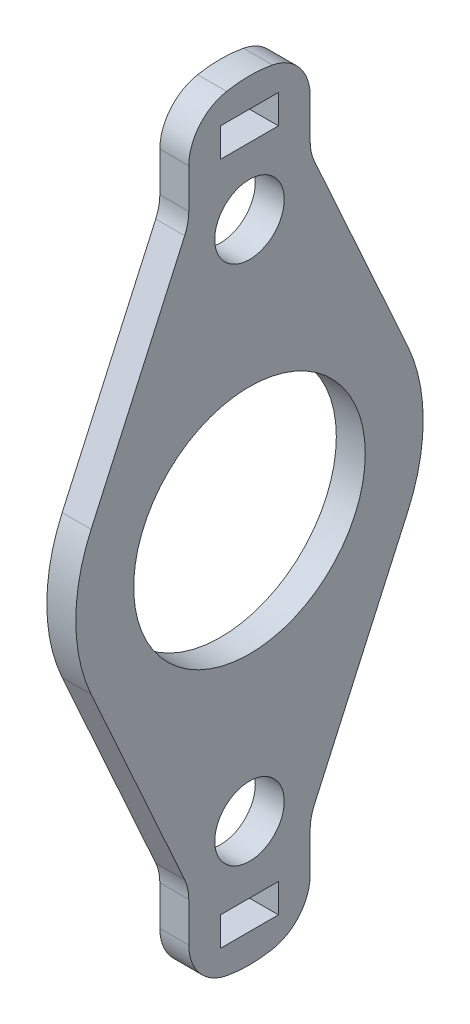
ISO-10303-21;
HEADER;
FILE_DESCRIPTION(('STEP AP214'),'2;1');
FILE_NAME('part.step','',(''),(''),'','','');
FILE_SCHEMA(('AUTOMOTIVE_DESIGN { 1 0 10303 214 1 1 1 1 }'));
ENDSEC;
DATA;
#1=APPLICATION_CONTEXT('core data for automotive mechanical design processes');
#2=APPLICATION_PROTOCOL_DEFINITION('international standard','automotive_design',2000,#1);
#3=PRODUCT_CONTEXT('',#1,'mechanical');
#4=PRODUCT('Part','Part','',(#3));
#5=PRODUCT_RELATED_PRODUCT_CATEGORY('part','',(#4));
#6=PRODUCT_DEFINITION_FORMATION('','',#4);
#7=PRODUCT_DEFINITION_CONTEXT('part definition',#1,'design');
#8=PRODUCT_DEFINITION('design','',#6,#7);
#9=PRODUCT_DEFINITION_SHAPE('','',#8);
#10=(LENGTH_UNIT() NAMED_UNIT(*) SI_UNIT(.MILLI.,.METRE.));
#11=(NAMED_UNIT(*) PLANE_ANGLE_UNIT() SI_UNIT($,.RADIAN.));
#12=(NAMED_UNIT(*) SI_UNIT($,.STERADIAN.) SOLID_ANGLE_UNIT());
#13=UNCERTAINTY_MEASURE_WITH_UNIT(LENGTH_MEASURE(1.E-05),#10,'distance_accuracy_value','');
#14=(GEOMETRIC_REPRESENTATION_CONTEXT(3) GLOBAL_UNCERTAINTY_ASSIGNED_CONTEXT((#13)) GLOBAL_UNIT_ASSIGNED_CONTEXT((#10,
#11,#12)) REPRESENTATION_CONTEXT('',''));
#15=CARTESIAN_POINT('',(0.,0.,0.));
#16=DIRECTION('',(0.,0.,1.));
#17=DIRECTION('',(1.,0.,0.));
#18=AXIS2_PLACEMENT_3D('',#15,#16,#17);
#19=CARTESIAN_POINT('',(2.5,0.,0.));
#20=DIRECTION('',(1.,0.,0.));
#21=DIRECTION('',(0.,0.,-1.));
#22=AXIS2_PLACEMENT_3D('',#19,#20,#21);
#23=PLANE('',#22);
#24=DIRECTION('',(0.,0.,1.));
#25=VECTOR('',#24,1.);
#26=CARTESIAN_POINT('',(2.5,61.5,-5.00000000000002));
#27=LINE('',#26,#25);
#28=CARTESIAN_POINT('',(2.5,61.5,-5.00000000000002));
#29=VERTEX_POINT('',#28);
#30=CARTESIAN_POINT('',(2.5,61.5,4.99999999999998));
#31=VERTEX_POINT('',#30);
#32=EDGE_CURVE('E234',#29,#31,#27,.T.);
#33=ORIENTED_EDGE('',*,*,#32,.F.);
#34=DIRECTION('',(0.,1.,0.));
#35=VECTOR('',#34,1.);
#36=CARTESIAN_POINT('',(2.5,61.5,-5.00000000000002));
#37=LINE('',#36,#35);
#38=CARTESIAN_POINT('',(2.5,56.5,-5.00000000000002));
#39=VERTEX_POINT('',#38);
#40=EDGE_CURVE('E226',#39,#29,#37,.T.);
#41=ORIENTED_EDGE('',*,*,#40,.F.);
#42=DIRECTION('',(0.,0.,-1.));
#43=VECTOR('',#42,1.);
#44=CARTESIAN_POINT('',(2.5,56.5,-5.00000000000002));
#45=LINE('',#44,#43);
#46=CARTESIAN_POINT('',(2.5,56.5,4.99999999999998));
#47=VERTEX_POINT('',#46);
#48=EDGE_CURVE('E249',#47,#39,#45,.T.);
#49=ORIENTED_EDGE('',*,*,#48,.F.);
#50=DIRECTION('',(0.,-1.,0.));
#51=VECTOR('',#50,1.);
#52=CARTESIAN_POINT('',(2.5,61.5,4.99999999999998));
#53=LINE('',#52,#51);
#54=EDGE_CURVE('E247',#31,#47,#53,.T.);
#55=ORIENTED_EDGE('',*,*,#54,.F.);
#56=EDGE_LOOP('',(#33,#41,#49,#55));
#57=FACE_BOUND('',#56,.T.);
#58=DIRECTION('',(0.,0.,1.));
#59=VECTOR('',#58,1.);
#60=CARTESIAN_POINT('',(2.5,-56.5,-5.00000000000002));
#61=LINE('',#60,#59);
#62=CARTESIAN_POINT('',(2.5,-56.5,-5.00000000000002));
#63=VERTEX_POINT('',#62);
#64=CARTESIAN_POINT('',(2.5,-56.5,4.99999999999998));
#65=VERTEX_POINT('',#64);
#66=EDGE_CURVE('E267',#63,#65,#61,.T.);
#67=ORIENTED_EDGE('',*,*,#66,.F.);
#68=DIRECTION('',(0.,1.,0.));
#69=VECTOR('',#68,1.);
#70=CARTESIAN_POINT('',(2.5,-61.5,-5.00000000000002));
#71=LINE('',#70,#69);
#72=CARTESIAN_POINT('',(2.5,-61.5,-5.00000000000002));
#73=VERTEX_POINT('',#72);
#74=EDGE_CURVE('E265',#73,#63,#71,.T.);
#75=ORIENTED_EDGE('',*,*,#74,.F.);
#76=DIRECTION('',(0.,0.,-1.));
#77=VECTOR('',#76,1.);
#78=CARTESIAN_POINT('',(2.5,-61.5,-5.00000000000002));
#79=LINE('',#78,#77);
#80=CARTESIAN_POINT('',(2.5,-61.5,4.99999999999998));
#81=VERTEX_POINT('',#80);
#82=EDGE_CURVE('E273',#81,#73,#79,.T.);
#83=ORIENTED_EDGE('',*,*,#82,.F.);
#84=DIRECTION('',(0.,-1.,0.));
#85=VECTOR('',#84,1.);
#86=CARTESIAN_POINT('',(2.5,-61.5,4.99999999999998));
#87=LINE('',#86,#85);
#88=EDGE_CURVE('E270',#65,#81,#87,.T.);
#89=ORIENTED_EDGE('',*,*,#88,.F.);
#90=EDGE_LOOP('',(#67,#75,#83,#89));
#91=FACE_BOUND('',#90,.T.);
#92=CARTESIAN_POINT('',(2.5,45.,0.));
#93=DIRECTION('',(1.,0.,0.));
#94=DIRECTION('',(0.,0.,-1.));
#95=AXIS2_PLACEMENT_3D('',#92,#93,#94);
#96=CIRCLE('',#95,6.);
#97=CARTESIAN_POINT('',(2.5,45.,-6.));
#98=VERTEX_POINT('',#97);
#99=EDGE_CURVE('E296',#98,#98,#96,.T.);
#100=ORIENTED_EDGE('',*,*,#99,.F.);
#101=EDGE_LOOP('',(#100));
#102=FACE_BOUND('',#101,.T.);
#103=CARTESIAN_POINT('',(2.5,0.,0.));
#104=DIRECTION('',(1.,0.,0.));
#105=DIRECTION('',(0.,0.,-1.));
#106=AXIS2_PLACEMENT_3D('',#103,#104,#105);
#107=CIRCLE('',#106,30.);
#108=CARTESIAN_POINT('',(2.5,12.3333333333333,27.3475572746249));
#109=VERTEX_POINT('',#108);
#110=CARTESIAN_POINT('',(2.5,-12.3333333333333,27.3475572746249));
#111=VERTEX_POINT('',#110);
#112=EDGE_CURVE('E308',#109,#111,#107,.T.);
#113=ORIENTED_EDGE('',*,*,#112,.T.);
#114=DIRECTION('',(0.,-0.911585242487497,-0.411111111111111));
#115=VECTOR('',#114,1.);
#116=CARTESIAN_POINT('',(2.5,-48.1593922783214,11.1905483487062));
#117=LINE('',#116,#115);
#118=CARTESIAN_POINT('',(2.5,-48.1593922783214,11.1905483487062));
#119=VERTEX_POINT('',#118);
#120=EDGE_CURVE('E311',#111,#119,#117,.T.);
#121=ORIENTED_EDGE('',*,*,#120,.T.);
#122=CARTESIAN_POINT('',(2.5,-51.4482811672103,18.4832302886062));
#123=DIRECTION('',(-1.,0.,0.));
#124=DIRECTION('',(0.,0.,1.));
#125=AXIS2_PLACEMENT_3D('',#122,#123,#124);
#126=CIRCLE('',#125,8.);
#127=CARTESIAN_POINT('',(2.5,-51.4482811672103,10.4832302886062));
#128=VERTEX_POINT('',#127);
#129=EDGE_CURVE('E314',#119,#128,#126,.T.);
#130=ORIENTED_EDGE('',*,*,#129,.T.);
#131=DIRECTION('',(0.,-1.,0.));
#132=VECTOR('',#131,1.);
#133=CARTESIAN_POINT('',(2.5,-51.4482811672103,10.4832302886062));
#134=LINE('',#133,#132);
#135=CARTESIAN_POINT('',(2.5,-58.2696483500411,10.4832302886062));
#136=VERTEX_POINT('',#135);
#137=EDGE_CURVE('E316',#128,#136,#134,.T.);
#138=ORIENTED_EDGE('',*,*,#137,.T.);
#139=CARTESIAN_POINT('',(2.5,-58.2696483500411,2.4832302886062));
#140=DIRECTION('',(1.,0.,0.));
#141=DIRECTION('',(0.,0.,-1.));
#142=AXIS2_PLACEMENT_3D('',#139,#140,#141);
#143=CIRCLE('',#142,8.);
#144=CARTESIAN_POINT('',(2.5,-66.133143668584,3.95477416333581));
#145=VERTEX_POINT('',#144);
#146=EDGE_CURVE('E318',#136,#145,#143,.T.);
#147=ORIENTED_EDGE('',*,*,#146,.T.);
#148=CARTESIAN_POINT('',(2.5,-45.,0.));
#149=DIRECTION('',(1.,0.,0.));
#150=DIRECTION('',(0.,0.,-1.));
#151=AXIS2_PLACEMENT_3D('',#148,#149,#150);
#152=CIRCLE('',#151,21.5);
#153=CARTESIAN_POINT('',(2.5,-66.133143668584,-3.9547741633358));
#154=VERTEX_POINT('',#153);
#155=EDGE_CURVE('E320',#145,#154,#152,.T.);
#156=ORIENTED_EDGE('',*,*,#155,.T.);
#157=CARTESIAN_POINT('',(2.5,-58.2696483500411,-2.4832302886062));
#158=DIRECTION('',(1.,0.,0.));
#159=DIRECTION('',(0.,0.,1.));
#160=AXIS2_PLACEMENT_3D('',#157,#158,#159);
#161=CIRCLE('',#160,8.);
#162=CARTESIAN_POINT('',(2.5,-58.2696483500411,-10.4832302886062));
#163=VERTEX_POINT('',#162);
#164=EDGE_CURVE('E322',#154,#163,#161,.T.);
#165=ORIENTED_EDGE('',*,*,#164,.T.);
#166=DIRECTION('',(0.,1.,0.));
#167=VECTOR('',#166,1.);
#168=CARTESIAN_POINT('',(2.5,-51.4482811672103,-10.4832302886062));
#169=LINE('',#168,#167);
#170=CARTESIAN_POINT('',(2.5,-51.4482811672103,-10.4832302886062));
#171=VERTEX_POINT('',#170);
#172=EDGE_CURVE('E324',#163,#171,#169,.T.);
#173=ORIENTED_EDGE('',*,*,#172,.T.);
#174=CARTESIAN_POINT('',(2.5,-51.4482811672103,-18.4832302886062));
#175=DIRECTION('',(-1.,0.,0.));
#176=DIRECTION('',(0.,0.,-1.));
#177=AXIS2_PLACEMENT_3D('',#174,#175,#176);
#178=CIRCLE('',#177,8.);
#179=CARTESIAN_POINT('',(2.5,-48.1593922783214,-11.1905483487062));
#180=VERTEX_POINT('',#179);
#181=EDGE_CURVE('E326',#171,#180,#178,.T.);
#182=ORIENTED_EDGE('',*,*,#181,.T.);
#183=DIRECTION('',(0.,0.911585242487496,-0.411111111111111));
#184=VECTOR('',#183,1.);
#185=CARTESIAN_POINT('',(2.5,-48.1593922783214,-11.1905483487062));
#186=LINE('',#185,#184);
#187=CARTESIAN_POINT('',(2.5,-12.3333333333334,-27.3475572746249));
#188=VERTEX_POINT('',#187);
#189=EDGE_CURVE('E328',#180,#188,#186,.T.);
#190=ORIENTED_EDGE('',*,*,#189,.T.);
#191=CARTESIAN_POINT('',(2.5,0.,0.));
#192=DIRECTION('',(1.,0.,0.));
#193=DIRECTION('',(0.,0.,-1.));
#194=AXIS2_PLACEMENT_3D('',#191,#192,#193);
#195=CIRCLE('',#194,30.);
#196=CARTESIAN_POINT('',(2.5,12.3333333333333,-27.3475572746249));
#197=VERTEX_POINT('',#196);
#198=EDGE_CURVE('E330',#188,#197,#195,.T.);
#199=ORIENTED_EDGE('',*,*,#198,.T.);
#200=DIRECTION('',(0.,0.911585242487497,0.411111111111111));
#201=VECTOR('',#200,1.);
#202=CARTESIAN_POINT('',(2.5,48.1593922783214,-11.1905483487062));
#203=LINE('',#202,#201);
#204=CARTESIAN_POINT('',(2.5,48.1593922783214,-11.1905483487062));
#205=VERTEX_POINT('',#204);
#206=EDGE_CURVE('E332',#197,#205,#203,.T.);
#207=ORIENTED_EDGE('',*,*,#206,.T.);
#208=CARTESIAN_POINT('',(2.5,51.4482811672103,-18.4832302886062));
#209=DIRECTION('',(-1.,0.,0.));
#210=DIRECTION('',(0.,0.,1.));
#211=AXIS2_PLACEMENT_3D('',#208,#209,#210);
#212=CIRCLE('',#211,8.);
#213=CARTESIAN_POINT('',(2.5,51.4482811672103,-10.4832302886062));
#214=VERTEX_POINT('',#213);
#215=EDGE_CURVE('E334',#205,#214,#212,.T.);
#216=ORIENTED_EDGE('',*,*,#215,.T.);
#217=DIRECTION('',(0.,1.,0.));
#218=VECTOR('',#217,1.);
#219=CARTESIAN_POINT('',(2.5,51.4482811672103,-10.4832302886062));
#220=LINE('',#219,#218);
#221=CARTESIAN_POINT('',(2.5,58.2696483500411,-10.4832302886062));
#222=VERTEX_POINT('',#221);
#223=EDGE_CURVE('E336',#214,#222,#220,.T.);
#224=ORIENTED_EDGE('',*,*,#223,.T.);
#225=CARTESIAN_POINT('',(2.5,58.2696483500411,-2.4832302886062));
#226=DIRECTION('',(1.,0.,0.));
#227=DIRECTION('',(0.,0.,-1.));
#228=AXIS2_PLACEMENT_3D('',#225,#226,#227);
#229=CIRCLE('',#228,8.);
#230=CARTESIAN_POINT('',(2.5,66.133143668584,-3.9547741633358));
#231=VERTEX_POINT('',#230);
#232=EDGE_CURVE('E338',#222,#231,#229,.T.);
#233=ORIENTED_EDGE('',*,*,#232,.T.);
#234=CARTESIAN_POINT('',(2.5,45.,0.));
#235=DIRECTION('',(1.,0.,0.));
#236=DIRECTION('',(0.,0.,1.));
#237=AXIS2_PLACEMENT_3D('',#234,#235,#236);
#238=CIRCLE('',#237,21.5);
#239=CARTESIAN_POINT('',(2.5,66.133143668584,3.9547741633358));
#240=VERTEX_POINT('',#239);
#241=EDGE_CURVE('E340',#231,#240,#238,.T.);
#242=ORIENTED_EDGE('',*,*,#241,.T.);
#243=CARTESIAN_POINT('',(2.5,58.2696483500411,2.4832302886062));
#244=DIRECTION('',(1.,0.,0.));
#245=DIRECTION('',(0.,0.,-1.));
#246=AXIS2_PLACEMENT_3D('',#243,#244,#245);
#247=CIRCLE('',#246,8.);
#248=CARTESIAN_POINT('',(2.5,58.2696483500411,10.4832302886062));
#249=VERTEX_POINT('',#248);
#250=EDGE_CURVE('E342',#240,#249,#247,.T.);
#251=ORIENTED_EDGE('',*,*,#250,.T.);
#252=DIRECTION('',(0.,-1.,0.));
#253=VECTOR('',#252,1.);
#254=CARTESIAN_POINT('',(2.5,51.4482811672103,10.4832302886062));
#255=LINE('',#254,#253);
#256=CARTESIAN_POINT('',(2.5,51.4482811672103,10.4832302886062));
#257=VERTEX_POINT('',#256);
#258=EDGE_CURVE('E344',#249,#257,#255,.T.);
#259=ORIENTED_EDGE('',*,*,#258,.T.);
#260=CARTESIAN_POINT('',(2.5,51.4482811672103,18.4832302886062));
#261=DIRECTION('',(-1.,0.,0.));
#262=DIRECTION('',(0.,0.,-1.));
#263=AXIS2_PLACEMENT_3D('',#260,#261,#262);
#264=CIRCLE('',#263,8.);
#265=CARTESIAN_POINT('',(2.5,48.1593922783214,11.1905483487062));
#266=VERTEX_POINT('',#265);
#267=EDGE_CURVE('E346',#257,#266,#264,.T.);
#268=ORIENTED_EDGE('',*,*,#267,.T.);
#269=DIRECTION('',(0.,-0.911585242487496,0.411111111111111));
#270=VECTOR('',#269,1.);
#271=CARTESIAN_POINT('',(2.5,48.1593922783214,11.1905483487062));
#272=LINE('',#271,#270);
#273=EDGE_CURVE('E348',#266,#109,#272,.T.);
#274=ORIENTED_EDGE('',*,*,#273,.T.);
#275=EDGE_LOOP('',(#113,#121,#130,#138,#147,#156,#165,#173,#182,#190,#199,#207,#216,#224,#233,
#242,#251,#259,#268,#274));
#276=FACE_BOUND('',#275,.T.);
#277=CARTESIAN_POINT('',(2.5,-45.,0.));
#278=DIRECTION('',(1.,0.,0.));
#279=DIRECTION('',(0.,0.,-1.));
#280=AXIS2_PLACEMENT_3D('',#277,#278,#279);
#281=CIRCLE('',#280,6.);
#282=CARTESIAN_POINT('',(2.5,-45.,-6.));
#283=VERTEX_POINT('',#282);
#284=EDGE_CURVE('E302',#283,#283,#281,.T.);
#285=ORIENTED_EDGE('',*,*,#284,.F.);
#286=EDGE_LOOP('',(#285));
#287=FACE_BOUND('',#286,.T.);
#288=CARTESIAN_POINT('',(2.5,0.,0.));
#289=DIRECTION('',(1.,0.,0.));
#290=DIRECTION('',(0.,0.,-1.));
#291=AXIS2_PLACEMENT_3D('',#288,#289,#290);
#292=CIRCLE('',#291,20.);
#293=CARTESIAN_POINT('',(2.5,0.,-20.));
#294=VERTEX_POINT('',#293);
#295=EDGE_CURVE('E255',#294,#294,#292,.T.);
#296=ORIENTED_EDGE('',*,*,#295,.F.);
#297=EDGE_LOOP('',(#296));
#298=FACE_BOUND('',#297,.T.);
#299=ADVANCED_FACE('F41',(#57,#91,#102,#276,#287,#298),#23,.T.);
#300=CARTESIAN_POINT('',(-2.5,0.,0.));
#301=DIRECTION('',(1.,0.,0.));
#302=DIRECTION('',(0.,0.,-1.));
#303=AXIS2_PLACEMENT_3D('',#300,#301,#302);
#304=PLANE('',#303);
#305=DIRECTION('',(0.,1.,0.));
#306=VECTOR('',#305,1.);
#307=CARTESIAN_POINT('',(-2.5,-61.5,-5.00000000000002));
#308=LINE('',#307,#306);
#309=CARTESIAN_POINT('',(-2.5,-61.5,-5.00000000000002));
#310=VERTEX_POINT('',#309);
#311=CARTESIAN_POINT('',(-2.5,-56.5,-5.00000000000002));
#312=VERTEX_POINT('',#311);
#313=EDGE_CURVE('E242',#310,#312,#308,.T.);
#314=ORIENTED_EDGE('',*,*,#313,.T.);
#315=DIRECTION('',(0.,0.,1.));
#316=VECTOR('',#315,1.);
#317=CARTESIAN_POINT('',(-2.5,-56.5,-5.00000000000002));
#318=LINE('',#317,#316);
#319=CARTESIAN_POINT('',(-2.5,-56.5,4.99999999999998));
#320=VERTEX_POINT('',#319);
#321=EDGE_CURVE('E278',#312,#320,#318,.T.);
#322=ORIENTED_EDGE('',*,*,#321,.T.);
#323=DIRECTION('',(0.,-1.,0.));
#324=VECTOR('',#323,1.);
#325=CARTESIAN_POINT('',(-2.5,-61.5,4.99999999999998));
#326=LINE('',#325,#324);
#327=CARTESIAN_POINT('',(-2.5,-61.5,4.99999999999998));
#328=VERTEX_POINT('',#327);
#329=EDGE_CURVE('E281',#320,#328,#326,.T.);
#330=ORIENTED_EDGE('',*,*,#329,.T.);
#331=DIRECTION('',(0.,0.,-1.));
#332=VECTOR('',#331,1.);
#333=CARTESIAN_POINT('',(-2.5,-61.5,-5.00000000000002));
#334=LINE('',#333,#332);
#335=EDGE_CURVE('E268',#328,#310,#334,.T.);
#336=ORIENTED_EDGE('',*,*,#335,.T.);
#337=EDGE_LOOP('',(#314,#322,#330,#336));
#338=FACE_BOUND('',#337,.T.);
#339=CARTESIAN_POINT('',(-2.5,0.,0.));
#340=DIRECTION('',(1.,0.,0.));
#341=DIRECTION('',(0.,0.,-1.));
#342=AXIS2_PLACEMENT_3D('',#339,#340,#341);
#343=CIRCLE('',#342,30.);
#344=CARTESIAN_POINT('',(-2.5,12.3333333333333,27.3475572746249));
#345=VERTEX_POINT('',#344);
#346=CARTESIAN_POINT('',(-2.5,-12.3333333333333,27.3475572746249));
#347=VERTEX_POINT('',#346);
#348=EDGE_CURVE('E305',#345,#347,#343,.T.);
#349=ORIENTED_EDGE('',*,*,#348,.F.);
#350=DIRECTION('',(0.,-0.911585242487496,0.411111111111111));
#351=VECTOR('',#350,1.);
#352=CARTESIAN_POINT('',(-2.5,48.1593922783214,11.1905483487062));
#353=LINE('',#352,#351);
#354=CARTESIAN_POINT('',(-2.5,48.1593922783214,11.1905483487062));
#355=VERTEX_POINT('',#354);
#356=EDGE_CURVE('E312',#355,#345,#353,.T.);
#357=ORIENTED_EDGE('',*,*,#356,.F.);
#358=CARTESIAN_POINT('',(-2.5,51.4482811672103,18.4832302886062));
#359=DIRECTION('',(-1.,0.,0.));
#360=DIRECTION('',(0.,0.,-1.));
#361=AXIS2_PLACEMENT_3D('',#358,#359,#360);
#362=CIRCLE('',#361,8.);
#363=CARTESIAN_POINT('',(-2.5,51.4482811672103,10.4832302886062));
#364=VERTEX_POINT('',#363);
#365=EDGE_CURVE('E387',#364,#355,#362,.T.);
#366=ORIENTED_EDGE('',*,*,#365,.F.);
#367=DIRECTION('',(0.,-1.,0.));
#368=VECTOR('',#367,1.);
#369=CARTESIAN_POINT('',(-2.5,51.4482811672103,10.4832302886062));
#370=LINE('',#369,#368);
#371=CARTESIAN_POINT('',(-2.5,58.2696483500411,10.4832302886062));
#372=VERTEX_POINT('',#371);
#373=EDGE_CURVE('E385',#372,#364,#370,.T.);
#374=ORIENTED_EDGE('',*,*,#373,.F.);
#375=CARTESIAN_POINT('',(-2.5,58.2696483500411,2.4832302886062));
#376=DIRECTION('',(1.,0.,0.));
#377=DIRECTION('',(0.,0.,-1.));
#378=AXIS2_PLACEMENT_3D('',#375,#376,#377);
#379=CIRCLE('',#378,8.);
#380=CARTESIAN_POINT('',(-2.5,66.133143668584,3.9547741633358));
#381=VERTEX_POINT('',#380);
#382=EDGE_CURVE('E383',#381,#372,#379,.T.);
#383=ORIENTED_EDGE('',*,*,#382,.F.);
#384=CARTESIAN_POINT('',(-2.5,45.,0.));
#385=DIRECTION('',(1.,0.,0.));
#386=DIRECTION('',(0.,0.,1.));
#387=AXIS2_PLACEMENT_3D('',#384,#385,#386);
#388=CIRCLE('',#387,21.5);
#389=CARTESIAN_POINT('',(-2.5,66.133143668584,-3.9547741633358));
#390=VERTEX_POINT('',#389);
#391=EDGE_CURVE('E381',#390,#381,#388,.T.);
#392=ORIENTED_EDGE('',*,*,#391,.F.);
#393=CARTESIAN_POINT('',(-2.5,58.2696483500411,-2.4832302886062));
#394=DIRECTION('',(1.,0.,0.));
#395=DIRECTION('',(0.,0.,-1.));
#396=AXIS2_PLACEMENT_3D('',#393,#394,#395);
#397=CIRCLE('',#396,8.);
#398=CARTESIAN_POINT('',(-2.5,58.2696483500411,-10.4832302886062));
#399=VERTEX_POINT('',#398);
#400=EDGE_CURVE('E379',#399,#390,#397,.T.);
#401=ORIENTED_EDGE('',*,*,#400,.F.);
#402=DIRECTION('',(0.,1.,0.));
#403=VECTOR('',#402,1.);
#404=CARTESIAN_POINT('',(-2.5,51.4482811672103,-10.4832302886062));
#405=LINE('',#404,#403);
#406=CARTESIAN_POINT('',(-2.5,51.4482811672103,-10.4832302886062));
#407=VERTEX_POINT('',#406);
#408=EDGE_CURVE('E377',#407,#399,#405,.T.);
#409=ORIENTED_EDGE('',*,*,#408,.F.);
#410=CARTESIAN_POINT('',(-2.5,51.4482811672103,-18.4832302886062));
#411=DIRECTION('',(-1.,0.,0.));
#412=DIRECTION('',(0.,0.,1.));
#413=AXIS2_PLACEMENT_3D('',#410,#411,#412);
#414=CIRCLE('',#413,8.);
#415=CARTESIAN_POINT('',(-2.5,48.1593922783214,-11.1905483487062));
#416=VERTEX_POINT('',#415);
#417=EDGE_CURVE('E375',#416,#407,#414,.T.);
#418=ORIENTED_EDGE('',*,*,#417,.F.);
#419=DIRECTION('',(0.,0.911585242487497,0.411111111111111));
#420=VECTOR('',#419,1.);
#421=CARTESIAN_POINT('',(-2.5,48.1593922783214,-11.1905483487062));
#422=LINE('',#421,#420);
#423=CARTESIAN_POINT('',(-2.5,12.3333333333333,-27.3475572746249));
#424=VERTEX_POINT('',#423);
#425=EDGE_CURVE('E373',#424,#416,#422,.T.);
#426=ORIENTED_EDGE('',*,*,#425,.F.);
#427=CARTESIAN_POINT('',(-2.5,0.,0.));
#428=DIRECTION('',(1.,0.,0.));
#429=DIRECTION('',(0.,0.,-1.));
#430=AXIS2_PLACEMENT_3D('',#427,#428,#429);
#431=CIRCLE('',#430,30.);
#432=CARTESIAN_POINT('',(-2.5,-12.3333333333334,-27.3475572746249));
#433=VERTEX_POINT('',#432);
#434=EDGE_CURVE('E371',#433,#424,#431,.T.);
#435=ORIENTED_EDGE('',*,*,#434,.F.);
#436=DIRECTION('',(0.,0.911585242487496,-0.411111111111111));
#437=VECTOR('',#436,1.);
#438=CARTESIAN_POINT('',(-2.5,-48.1593922783214,-11.1905483487062));
#439=LINE('',#438,#437);
#440=CARTESIAN_POINT('',(-2.5,-48.1593922783214,-11.1905483487062));
#441=VERTEX_POINT('',#440);
#442=EDGE_CURVE('E369',#441,#433,#439,.T.);
#443=ORIENTED_EDGE('',*,*,#442,.F.);
#444=CARTESIAN_POINT('',(-2.5,-51.4482811672103,-18.4832302886062));
#445=DIRECTION('',(-1.,0.,0.));
#446=DIRECTION('',(0.,0.,-1.));
#447=AXIS2_PLACEMENT_3D('',#444,#445,#446);
#448=CIRCLE('',#447,8.);
#449=CARTESIAN_POINT('',(-2.5,-51.4482811672103,-10.4832302886062));
#450=VERTEX_POINT('',#449);
#451=EDGE_CURVE('E367',#450,#441,#448,.T.);
#452=ORIENTED_EDGE('',*,*,#451,.F.);
#453=DIRECTION('',(0.,1.,0.));
#454=VECTOR('',#453,1.);
#455=CARTESIAN_POINT('',(-2.5,-51.4482811672103,-10.4832302886062));
#456=LINE('',#455,#454);
#457=CARTESIAN_POINT('',(-2.5,-58.2696483500411,-10.4832302886062));
#458=VERTEX_POINT('',#457);
#459=EDGE_CURVE('E365',#458,#450,#456,.T.);
#460=ORIENTED_EDGE('',*,*,#459,.F.);
#461=CARTESIAN_POINT('',(-2.5,-58.2696483500411,-2.4832302886062));
#462=DIRECTION('',(1.,0.,0.));
#463=DIRECTION('',(0.,0.,1.));
#464=AXIS2_PLACEMENT_3D('',#461,#462,#463);
#465=CIRCLE('',#464,8.);
#466=CARTESIAN_POINT('',(-2.5,-66.133143668584,-3.9547741633358));
#467=VERTEX_POINT('',#466);
#468=EDGE_CURVE('E363',#467,#458,#465,.T.);
#469=ORIENTED_EDGE('',*,*,#468,.F.);
#470=CARTESIAN_POINT('',(-2.5,-45.,0.));
#471=DIRECTION('',(1.,0.,0.));
#472=DIRECTION('',(0.,0.,-1.));
#473=AXIS2_PLACEMENT_3D('',#470,#471,#472);
#474=CIRCLE('',#473,21.5);
#475=CARTESIAN_POINT('',(-2.5,-66.133143668584,3.95477416333581));
#476=VERTEX_POINT('',#475);
#477=EDGE_CURVE('E361',#476,#467,#474,.T.);
#478=ORIENTED_EDGE('',*,*,#477,.F.);
#479=CARTESIAN_POINT('',(-2.5,-58.2696483500411,2.4832302886062));
#480=DIRECTION('',(1.,0.,0.));
#481=DIRECTION('',(0.,0.,-1.));
#482=AXIS2_PLACEMENT_3D('',#479,#480,#481);
#483=CIRCLE('',#482,8.);
#484=CARTESIAN_POINT('',(-2.5,-58.2696483500411,10.4832302886062));
#485=VERTEX_POINT('',#484);
#486=EDGE_CURVE('E359',#485,#476,#483,.T.);
#487=ORIENTED_EDGE('',*,*,#486,.F.);
#488=DIRECTION('',(0.,-1.,0.));
#489=VECTOR('',#488,1.);
#490=CARTESIAN_POINT('',(-2.5,-51.4482811672103,10.4832302886062));
#491=LINE('',#490,#489);
#492=CARTESIAN_POINT('',(-2.5,-51.4482811672103,10.4832302886062));
#493=VERTEX_POINT('',#492);
#494=EDGE_CURVE('E357',#493,#485,#491,.T.);
#495=ORIENTED_EDGE('',*,*,#494,.F.);
#496=CARTESIAN_POINT('',(-2.5,-51.4482811672103,18.4832302886062));
#497=DIRECTION('',(-1.,0.,0.));
#498=DIRECTION('',(0.,0.,1.));
#499=AXIS2_PLACEMENT_3D('',#496,#497,#498);
#500=CIRCLE('',#499,8.);
#501=CARTESIAN_POINT('',(-2.5,-48.1593922783214,11.1905483487062));
#502=VERTEX_POINT('',#501);
#503=EDGE_CURVE('E355',#502,#493,#500,.T.);
#504=ORIENTED_EDGE('',*,*,#503,.F.);
#505=DIRECTION('',(0.,-0.911585242487497,-0.411111111111111));
#506=VECTOR('',#505,1.);
#507=CARTESIAN_POINT('',(-2.5,-48.1593922783214,11.1905483487062));
#508=LINE('',#507,#506);
#509=EDGE_CURVE('E353',#347,#502,#508,.T.);
#510=ORIENTED_EDGE('',*,*,#509,.F.);
#511=EDGE_LOOP('',(#349,#357,#366,#374,#383,#392,#401,#409,#418,#426,#435,#443,#452,#460,#469,
#478,#487,#495,#504,#510));
#512=FACE_BOUND('',#511,.T.);
#513=CARTESIAN_POINT('',(-2.5,-45.,0.));
#514=DIRECTION('',(1.,0.,0.));
#515=DIRECTION('',(0.,0.,-1.));
#516=AXIS2_PLACEMENT_3D('',#513,#514,#515);
#517=CIRCLE('',#516,6.);
#518=CARTESIAN_POINT('',(-2.5,-45.,-6.));
#519=VERTEX_POINT('',#518);
#520=EDGE_CURVE('E299',#519,#519,#517,.T.);
#521=ORIENTED_EDGE('',*,*,#520,.T.);
#522=EDGE_LOOP('',(#521));
#523=FACE_BOUND('',#522,.T.);
#524=CARTESIAN_POINT('',(-2.5,45.,0.));
#525=DIRECTION('',(1.,0.,0.));
#526=DIRECTION('',(0.,0.,-1.));
#527=AXIS2_PLACEMENT_3D('',#524,#525,#526);
#528=CIRCLE('',#527,6.);
#529=CARTESIAN_POINT('',(-2.5,45.,-6.));
#530=VERTEX_POINT('',#529);
#531=EDGE_CURVE('E295',#530,#530,#528,.T.);
#532=ORIENTED_EDGE('',*,*,#531,.T.);
#533=EDGE_LOOP('',(#532));
#534=FACE_BOUND('',#533,.T.);
#535=DIRECTION('',(0.,1.,0.));
#536=VECTOR('',#535,1.);
#537=CARTESIAN_POINT('',(-2.5,61.5,-5.00000000000002));
#538=LINE('',#537,#536);
#539=CARTESIAN_POINT('',(-2.5,56.5,-5.00000000000002));
#540=VERTEX_POINT('',#539);
#541=CARTESIAN_POINT('',(-2.5,61.5,-5.00000000000002));
#542=VERTEX_POINT('',#541);
#543=EDGE_CURVE('E64',#540,#542,#538,.T.);
#544=ORIENTED_EDGE('',*,*,#543,.T.);
#545=DIRECTION('',(0.,0.,1.));
#546=VECTOR('',#545,1.);
#547=CARTESIAN_POINT('',(-2.5,61.5,-5.00000000000002));
#548=LINE('',#547,#546);
#549=CARTESIAN_POINT('',(-2.5,61.5,4.99999999999998));
#550=VERTEX_POINT('',#549);
#551=EDGE_CURVE('E241',#542,#550,#548,.T.);
#552=ORIENTED_EDGE('',*,*,#551,.T.);
#553=DIRECTION('',(0.,-1.,0.));
#554=VECTOR('',#553,1.);
#555=CARTESIAN_POINT('',(-2.5,61.5,4.99999999999998));
#556=LINE('',#555,#554);
#557=CARTESIAN_POINT('',(-2.5,56.5,4.99999999999998));
#558=VERTEX_POINT('',#557);
#559=EDGE_CURVE('E257',#550,#558,#556,.T.);
#560=ORIENTED_EDGE('',*,*,#559,.T.);
#561=DIRECTION('',(0.,0.,-1.));
#562=VECTOR('',#561,1.);
#563=CARTESIAN_POINT('',(-2.5,56.5,-5.00000000000002));
#564=LINE('',#563,#562);
#565=EDGE_CURVE('E235',#558,#540,#564,.T.);
#566=ORIENTED_EDGE('',*,*,#565,.T.);
#567=EDGE_LOOP('',(#544,#552,#560,#566));
#568=FACE_BOUND('',#567,.T.);
#569=CARTESIAN_POINT('',(-2.5,0.,0.));
#570=DIRECTION('',(1.,0.,0.));
#571=DIRECTION('',(0.,0.,-1.));
#572=AXIS2_PLACEMENT_3D('',#569,#570,#571);
#573=CIRCLE('',#572,20.);
#574=CARTESIAN_POINT('',(-2.5,0.,-20.));
#575=VERTEX_POINT('',#574);
#576=EDGE_CURVE('E830',#575,#575,#573,.T.);
#577=ORIENTED_EDGE('',*,*,#576,.T.);
#578=EDGE_LOOP('',(#577));
#579=FACE_BOUND('',#578,.T.);
#580=ADVANCED_FACE('F453',(#338,#512,#523,#534,#568,#579),#304,.F.);
#581=CARTESIAN_POINT('',(2.5,0.,0.));
#582=DIRECTION('',(-1.,0.,0.));
#583=DIRECTION('',(0.,0.,1.));
#584=AXIS2_PLACEMENT_3D('',#581,#582,#583);
#585=CYLINDRICAL_SURFACE('',#584,30.);
#586=ORIENTED_EDGE('',*,*,#348,.T.);
#587=DIRECTION('',(-1.,0.,0.));
#588=VECTOR('',#587,1.);
#589=CARTESIAN_POINT('',(2.5,-12.3333333333333,27.3475572746249));
#590=LINE('',#589,#588);
#591=EDGE_CURVE('E11',#111,#347,#590,.T.);
#592=ORIENTED_EDGE('',*,*,#591,.F.);
#593=ORIENTED_EDGE('',*,*,#112,.F.);
#594=DIRECTION('',(-1.,0.,0.));
#595=VECTOR('',#594,1.);
#596=CARTESIAN_POINT('',(2.5,12.3333333333333,27.3475572746249));
#597=LINE('',#596,#595);
#598=EDGE_CURVE('E350',#109,#345,#597,.T.);
#599=ORIENTED_EDGE('',*,*,#598,.T.);
#600=EDGE_LOOP('',(#586,#592,#593,#599));
#601=FACE_BOUND('',#600,.T.);
#602=ADVANCED_FACE('F43',(#601),#585,.T.);
#603=CARTESIAN_POINT('',(2.5,-48.1593922783214,11.1905483487062));
#604=DIRECTION('',(0.,0.411111111111111,-0.911585242487497));
#605=DIRECTION('',(0.,0.911585242487496,0.411111111111111));
#606=AXIS2_PLACEMENT_3D('',#603,#604,#605);
#607=PLANE('',#606);
#608=ORIENTED_EDGE('',*,*,#509,.T.);
#609=DIRECTION('',(-1.,0.,0.));
#610=VECTOR('',#609,1.);
#611=CARTESIAN_POINT('',(2.5,-48.1593922783214,11.1905483487062));
#612=LINE('',#611,#610);
#613=EDGE_CURVE('E49',#119,#502,#612,.T.);
#614=ORIENTED_EDGE('',*,*,#613,.F.);
#615=ORIENTED_EDGE('',*,*,#120,.F.);
#616=ORIENTED_EDGE('',*,*,#591,.T.);
#617=EDGE_LOOP('',(#608,#614,#615,#616));
#618=FACE_BOUND('',#617,.T.);
#619=ADVANCED_FACE('F471',(#618),#607,.F.);
#620=CARTESIAN_POINT('',(2.5,-51.4482811672103,18.4832302886062));
#621=DIRECTION('',(-1.,0.,0.));
#622=DIRECTION('',(0.,0.,1.));
#623=AXIS2_PLACEMENT_3D('',#620,#621,#622);
#624=CYLINDRICAL_SURFACE('',#623,8.);
#625=ORIENTED_EDGE('',*,*,#503,.T.);
#626=DIRECTION('',(-1.,0.,0.));
#627=VECTOR('',#626,1.);
#628=CARTESIAN_POINT('',(2.5,-51.4482811672103,10.4832302886062));
#629=LINE('',#628,#627);
#630=EDGE_CURVE('E440',#128,#493,#629,.T.);
#631=ORIENTED_EDGE('',*,*,#630,.F.);
#632=ORIENTED_EDGE('',*,*,#129,.F.);
#633=ORIENTED_EDGE('',*,*,#613,.T.);
#634=EDGE_LOOP('',(#625,#631,#632,#633));
#635=FACE_BOUND('',#634,.T.);
#636=ADVANCED_FACE('F447',(#635),#624,.F.);
#637=CARTESIAN_POINT('',(2.5,-51.4482811672103,10.4832302886062));
#638=DIRECTION('',(0.,0.,-1.));
#639=DIRECTION('',(-1.,0.,0.));
#640=AXIS2_PLACEMENT_3D('',#637,#638,#639);
#641=PLANE('',#640);
#642=ORIENTED_EDGE('',*,*,#494,.T.);
#643=DIRECTION('',(-1.,0.,0.));
#644=VECTOR('',#643,1.);
#645=CARTESIAN_POINT('',(2.5,-58.2696483500411,10.4832302886062));
#646=LINE('',#645,#644);
#647=EDGE_CURVE('E437',#136,#485,#646,.T.);
#648=ORIENTED_EDGE('',*,*,#647,.F.);
#649=ORIENTED_EDGE('',*,*,#137,.F.);
#650=ORIENTED_EDGE('',*,*,#630,.T.);
#651=EDGE_LOOP('',(#642,#648,#649,#650));
#652=FACE_BOUND('',#651,.T.);
#653=ADVANCED_FACE('F459',(#652),#641,.F.);
#654=CARTESIAN_POINT('',(2.5,-58.2696483500411,2.4832302886062));
#655=DIRECTION('',(-1.,0.,0.));
#656=DIRECTION('',(0.,0.,1.));
#657=AXIS2_PLACEMENT_3D('',#654,#655,#656);
#658=CYLINDRICAL_SURFACE('',#657,8.);
#659=ORIENTED_EDGE('',*,*,#486,.T.);
#660=DIRECTION('',(-1.,0.,0.));
#661=VECTOR('',#660,1.);
#662=CARTESIAN_POINT('',(2.5,-66.133143668584,3.95477416333581));
#663=LINE('',#662,#661);
#664=EDGE_CURVE('E434',#145,#476,#663,.T.);
#665=ORIENTED_EDGE('',*,*,#664,.F.);
#666=ORIENTED_EDGE('',*,*,#146,.F.);
#667=ORIENTED_EDGE('',*,*,#647,.T.);
#668=EDGE_LOOP('',(#659,#665,#666,#667));
#669=FACE_BOUND('',#668,.T.);
#670=ADVANCED_FACE('F463',(#669),#658,.T.);
#671=CARTESIAN_POINT('',(2.5,-45.,0.));
#672=DIRECTION('',(-1.,0.,0.));
#673=DIRECTION('',(0.,0.,1.));
#674=AXIS2_PLACEMENT_3D('',#671,#672,#673);
#675=CYLINDRICAL_SURFACE('',#674,21.5);
#676=ORIENTED_EDGE('',*,*,#477,.T.);
#677=DIRECTION('',(-1.,0.,0.));
#678=VECTOR('',#677,1.);
#679=CARTESIAN_POINT('',(2.5,-66.133143668584,-3.9547741633358));
#680=LINE('',#679,#678);
#681=EDGE_CURVE('E431',#154,#467,#680,.T.);
#682=ORIENTED_EDGE('',*,*,#681,.F.);
#683=ORIENTED_EDGE('',*,*,#155,.F.);
#684=ORIENTED_EDGE('',*,*,#664,.T.);
#685=EDGE_LOOP('',(#676,#682,#683,#684));
#686=FACE_BOUND('',#685,.T.);
#687=ADVANCED_FACE('F544',(#686),#675,.T.);
#688=CARTESIAN_POINT('',(2.5,-58.2696483500411,-2.4832302886062));
#689=DIRECTION('',(-1.,0.,0.));
#690=DIRECTION('',(0.,0.,1.));
#691=AXIS2_PLACEMENT_3D('',#688,#689,#690);
#692=CYLINDRICAL_SURFACE('',#691,8.);
#693=ORIENTED_EDGE('',*,*,#468,.T.);
#694=DIRECTION('',(-1.,0.,0.));
#695=VECTOR('',#694,1.);
#696=CARTESIAN_POINT('',(2.5,-58.2696483500411,-10.4832302886062));
#697=LINE('',#696,#695);
#698=EDGE_CURVE('E428',#163,#458,#697,.T.);
#699=ORIENTED_EDGE('',*,*,#698,.F.);
#700=ORIENTED_EDGE('',*,*,#164,.F.);
#701=ORIENTED_EDGE('',*,*,#681,.T.);
#702=EDGE_LOOP('',(#693,#699,#700,#701));
#703=FACE_BOUND('',#702,.T.);
#704=ADVANCED_FACE('F542',(#703),#692,.T.);
#705=CARTESIAN_POINT('',(2.5,-51.4482811672103,-10.4832302886062));
#706=DIRECTION('',(0.,0.,1.));
#707=DIRECTION('',(1.,0.,0.));
#708=AXIS2_PLACEMENT_3D('',#705,#706,#707);
#709=PLANE('',#708);
#710=ORIENTED_EDGE('',*,*,#459,.T.);
#711=DIRECTION('',(-1.,0.,0.));
#712=VECTOR('',#711,1.);
#713=CARTESIAN_POINT('',(2.5,-51.4482811672103,-10.4832302886062));
#714=LINE('',#713,#712);
#715=EDGE_CURVE('E425',#171,#450,#714,.T.);
#716=ORIENTED_EDGE('',*,*,#715,.F.);
#717=ORIENTED_EDGE('',*,*,#172,.F.);
#718=ORIENTED_EDGE('',*,*,#698,.T.);
#719=EDGE_LOOP('',(#710,#716,#717,#718));
#720=FACE_BOUND('',#719,.T.);
#721=ADVANCED_FACE('F537',(#720),#709,.F.);
#722=CARTESIAN_POINT('',(2.5,-51.4482811672103,-18.4832302886062));
#723=DIRECTION('',(-1.,0.,0.));
#724=DIRECTION('',(0.,0.,1.));
#725=AXIS2_PLACEMENT_3D('',#722,#723,#724);
#726=CYLINDRICAL_SURFACE('',#725,8.);
#727=ORIENTED_EDGE('',*,*,#451,.T.);
#728=DIRECTION('',(-1.,0.,0.));
#729=VECTOR('',#728,1.);
#730=CARTESIAN_POINT('',(2.5,-48.1593922783214,-11.1905483487062));
#731=LINE('',#730,#729);
#732=EDGE_CURVE('E422',#180,#441,#731,.T.);
#733=ORIENTED_EDGE('',*,*,#732,.F.);
#734=ORIENTED_EDGE('',*,*,#181,.F.);
#735=ORIENTED_EDGE('',*,*,#715,.T.);
#736=EDGE_LOOP('',(#727,#733,#734,#735));
#737=FACE_BOUND('',#736,.T.);
#738=ADVANCED_FACE('F532',(#737),#726,.F.);
#739=CARTESIAN_POINT('',(2.5,-48.1593922783214,-11.1905483487062));
#740=DIRECTION('',(0.,0.411111111111111,0.911585242487496));
#741=DIRECTION('',(0.,-0.911585242487496,0.411111111111111));
#742=AXIS2_PLACEMENT_3D('',#739,#740,#741);
#743=PLANE('',#742);
#744=ORIENTED_EDGE('',*,*,#442,.T.);
#745=DIRECTION('',(-1.,0.,0.));
#746=VECTOR('',#745,1.);
#747=CARTESIAN_POINT('',(2.5,-12.3333333333334,-27.3475572746249));
#748=LINE('',#747,#746);
#749=EDGE_CURVE('E419',#188,#433,#748,.T.);
#750=ORIENTED_EDGE('',*,*,#749,.F.);
#751=ORIENTED_EDGE('',*,*,#189,.F.);
#752=ORIENTED_EDGE('',*,*,#732,.T.);
#753=EDGE_LOOP('',(#744,#750,#751,#752));
#754=FACE_BOUND('',#753,.T.);
#755=ADVANCED_FACE('F528',(#754),#743,.F.);
#756=CARTESIAN_POINT('',(2.5,0.,0.));
#757=DIRECTION('',(-1.,0.,0.));
#758=DIRECTION('',(0.,0.,1.));
#759=AXIS2_PLACEMENT_3D('',#756,#757,#758);
#760=CYLINDRICAL_SURFACE('',#759,30.);
#761=ORIENTED_EDGE('',*,*,#434,.T.);
#762=DIRECTION('',(-1.,0.,0.));
#763=VECTOR('',#762,1.);
#764=CARTESIAN_POINT('',(2.5,12.3333333333333,-27.3475572746249));
#765=LINE('',#764,#763);
#766=EDGE_CURVE('E416',#197,#424,#765,.T.);
#767=ORIENTED_EDGE('',*,*,#766,.F.);
#768=ORIENTED_EDGE('',*,*,#198,.F.);
#769=ORIENTED_EDGE('',*,*,#749,.T.);
#770=EDGE_LOOP('',(#761,#767,#768,#769));
#771=FACE_BOUND('',#770,.T.);
#772=ADVANCED_FACE('F523',(#771),#760,.T.);
#773=CARTESIAN_POINT('',(2.5,48.1593922783214,-11.1905483487062));
#774=DIRECTION('',(0.,-0.411111111111111,0.911585242487497));
#775=DIRECTION('',(0.,-0.911585242487496,-0.411111111111111));
#776=AXIS2_PLACEMENT_3D('',#773,#774,#775);
#777=PLANE('',#776);
#778=ORIENTED_EDGE('',*,*,#425,.T.);
#779=DIRECTION('',(-1.,0.,0.));
#780=VECTOR('',#779,1.);
#781=CARTESIAN_POINT('',(2.5,48.1593922783214,-11.1905483487062));
#782=LINE('',#781,#780);
#783=EDGE_CURVE('E413',#205,#416,#782,.T.);
#784=ORIENTED_EDGE('',*,*,#783,.F.);
#785=ORIENTED_EDGE('',*,*,#206,.F.);
#786=ORIENTED_EDGE('',*,*,#766,.T.);
#787=EDGE_LOOP('',(#778,#784,#785,#786));
#788=FACE_BOUND('',#787,.T.);
#789=ADVANCED_FACE('F517',(#788),#777,.F.);
#790=CARTESIAN_POINT('',(2.5,51.4482811672103,-18.4832302886062));
#791=DIRECTION('',(-1.,0.,0.));
#792=DIRECTION('',(0.,0.,1.));
#793=AXIS2_PLACEMENT_3D('',#790,#791,#792);
#794=CYLINDRICAL_SURFACE('',#793,8.);
#795=ORIENTED_EDGE('',*,*,#417,.T.);
#796=DIRECTION('',(-1.,0.,0.));
#797=VECTOR('',#796,1.);
#798=CARTESIAN_POINT('',(2.5,51.4482811672103,-10.4832302886062));
#799=LINE('',#798,#797);
#800=EDGE_CURVE('E410',#214,#407,#799,.T.);
#801=ORIENTED_EDGE('',*,*,#800,.F.);
#802=ORIENTED_EDGE('',*,*,#215,.F.);
#803=ORIENTED_EDGE('',*,*,#783,.T.);
#804=EDGE_LOOP('',(#795,#801,#802,#803));
#805=FACE_BOUND('',#804,.T.);
#806=ADVANCED_FACE('F513',(#805),#794,.F.);
#807=CARTESIAN_POINT('',(2.5,51.4482811672103,-10.4832302886062));
#808=DIRECTION('',(0.,0.,1.));
#809=DIRECTION('',(1.,0.,0.));
#810=AXIS2_PLACEMENT_3D('',#807,#808,#809);
#811=PLANE('',#810);
#812=ORIENTED_EDGE('',*,*,#408,.T.);
#813=DIRECTION('',(-1.,0.,0.));
#814=VECTOR('',#813,1.);
#815=CARTESIAN_POINT('',(2.5,58.2696483500411,-10.4832302886062));
#816=LINE('',#815,#814);
#817=EDGE_CURVE('E407',#222,#399,#816,.T.);
#818=ORIENTED_EDGE('',*,*,#817,.F.);
#819=ORIENTED_EDGE('',*,*,#223,.F.);
#820=ORIENTED_EDGE('',*,*,#800,.T.);
#821=EDGE_LOOP('',(#812,#818,#819,#820));
#822=FACE_BOUND('',#821,.T.);
#823=ADVANCED_FACE('F508',(#822),#811,.F.);
#824=CARTESIAN_POINT('',(2.5,58.2696483500411,-2.4832302886062));
#825=DIRECTION('',(-1.,0.,0.));
#826=DIRECTION('',(0.,0.,1.));
#827=AXIS2_PLACEMENT_3D('',#824,#825,#826);
#828=CYLINDRICAL_SURFACE('',#827,8.);
#829=ORIENTED_EDGE('',*,*,#400,.T.);
#830=DIRECTION('',(-1.,0.,0.));
#831=VECTOR('',#830,1.);
#832=CARTESIAN_POINT('',(2.5,66.133143668584,-3.9547741633358));
#833=LINE('',#832,#831);
#834=EDGE_CURVE('E404',#231,#390,#833,.T.);
#835=ORIENTED_EDGE('',*,*,#834,.F.);
#836=ORIENTED_EDGE('',*,*,#232,.F.);
#837=ORIENTED_EDGE('',*,*,#817,.T.);
#838=EDGE_LOOP('',(#829,#835,#836,#837));
#839=FACE_BOUND('',#838,.T.);
#840=ADVANCED_FACE('F502',(#839),#828,.T.);
#841=CARTESIAN_POINT('',(2.5,45.,0.));
#842=DIRECTION('',(-1.,0.,0.));
#843=DIRECTION('',(0.,0.,1.));
#844=AXIS2_PLACEMENT_3D('',#841,#842,#843);
#845=CYLINDRICAL_SURFACE('',#844,21.5);
#846=ORIENTED_EDGE('',*,*,#391,.T.);
#847=DIRECTION('',(-1.,0.,0.));
#848=VECTOR('',#847,1.);
#849=CARTESIAN_POINT('',(2.5,66.133143668584,3.9547741633358));
#850=LINE('',#849,#848);
#851=EDGE_CURVE('E401',#240,#381,#850,.T.);
#852=ORIENTED_EDGE('',*,*,#851,.F.);
#853=ORIENTED_EDGE('',*,*,#241,.F.);
#854=ORIENTED_EDGE('',*,*,#834,.T.);
#855=EDGE_LOOP('',(#846,#852,#853,#854));
#856=FACE_BOUND('',#855,.T.);
#857=ADVANCED_FACE('F498',(#856),#845,.T.);
#858=CARTESIAN_POINT('',(2.5,58.2696483500411,2.4832302886062));
#859=DIRECTION('',(-1.,0.,0.));
#860=DIRECTION('',(0.,0.,1.));
#861=AXIS2_PLACEMENT_3D('',#858,#859,#860);
#862=CYLINDRICAL_SURFACE('',#861,8.);
#863=ORIENTED_EDGE('',*,*,#382,.T.);
#864=DIRECTION('',(-1.,0.,0.));
#865=VECTOR('',#864,1.);
#866=CARTESIAN_POINT('',(2.5,58.2696483500411,10.4832302886062));
#867=LINE('',#866,#865);
#868=EDGE_CURVE('E398',#249,#372,#867,.T.);
#869=ORIENTED_EDGE('',*,*,#868,.F.);
#870=ORIENTED_EDGE('',*,*,#250,.F.);
#871=ORIENTED_EDGE('',*,*,#851,.T.);
#872=EDGE_LOOP('',(#863,#869,#870,#871));
#873=FACE_BOUND('',#872,.T.);
#874=ADVANCED_FACE('F493',(#873),#862,.T.);
#875=CARTESIAN_POINT('',(2.5,51.4482811672103,10.4832302886062));
#876=DIRECTION('',(0.,0.,-1.));
#877=DIRECTION('',(-1.,0.,0.));
#878=AXIS2_PLACEMENT_3D('',#875,#876,#877);
#879=PLANE('',#878);
#880=ORIENTED_EDGE('',*,*,#373,.T.);
#881=DIRECTION('',(-1.,0.,0.));
#882=VECTOR('',#881,1.);
#883=CARTESIAN_POINT('',(2.5,51.4482811672103,10.4832302886062));
#884=LINE('',#883,#882);
#885=EDGE_CURVE('E395',#257,#364,#884,.T.);
#886=ORIENTED_EDGE('',*,*,#885,.F.);
#887=ORIENTED_EDGE('',*,*,#258,.F.);
#888=ORIENTED_EDGE('',*,*,#868,.T.);
#889=EDGE_LOOP('',(#880,#886,#887,#888));
#890=FACE_BOUND('',#889,.T.);
#891=ADVANCED_FACE('F487',(#890),#879,.F.);
#892=CARTESIAN_POINT('',(2.5,51.4482811672103,18.4832302886062));
#893=DIRECTION('',(-1.,0.,0.));
#894=DIRECTION('',(0.,0.,1.));
#895=AXIS2_PLACEMENT_3D('',#892,#893,#894);
#896=CYLINDRICAL_SURFACE('',#895,8.);
#897=ORIENTED_EDGE('',*,*,#365,.T.);
#898=DIRECTION('',(-1.,0.,0.));
#899=VECTOR('',#898,1.);
#900=CARTESIAN_POINT('',(2.5,48.1593922783214,11.1905483487062));
#901=LINE('',#900,#899);
#902=EDGE_CURVE('E392',#266,#355,#901,.T.);
#903=ORIENTED_EDGE('',*,*,#902,.F.);
#904=ORIENTED_EDGE('',*,*,#267,.F.);
#905=ORIENTED_EDGE('',*,*,#885,.T.);
#906=EDGE_LOOP('',(#897,#903,#904,#905));
#907=FACE_BOUND('',#906,.T.);
#908=ADVANCED_FACE('F483',(#907),#896,.F.);
#909=CARTESIAN_POINT('',(2.5,48.1593922783214,11.1905483487062));
#910=DIRECTION('',(0.,-0.411111111111111,-0.911585242487496));
#911=DIRECTION('',(0.,0.911585242487496,-0.411111111111111));
#912=AXIS2_PLACEMENT_3D('',#909,#910,#911);
#913=PLANE('',#912);
#914=ORIENTED_EDGE('',*,*,#356,.T.);
#915=ORIENTED_EDGE('',*,*,#598,.F.);
#916=ORIENTED_EDGE('',*,*,#273,.F.);
#917=ORIENTED_EDGE('',*,*,#902,.T.);
#918=EDGE_LOOP('',(#914,#915,#916,#917));
#919=FACE_BOUND('',#918,.T.);
#920=ADVANCED_FACE('F478',(#919),#913,.F.);
#921=CARTESIAN_POINT('',(2.5,-45.,0.));
#922=DIRECTION('',(-1.,0.,0.));
#923=DIRECTION('',(0.,0.,1.));
#924=AXIS2_PLACEMENT_3D('',#921,#922,#923);
#925=CYLINDRICAL_SURFACE('',#924,6.);
#926=ORIENTED_EDGE('',*,*,#284,.T.);
#927=EDGE_LOOP('',(#926));
#928=FACE_BOUND('',#927,.T.);
#929=ORIENTED_EDGE('',*,*,#520,.F.);
#930=EDGE_LOOP('',(#929));
#931=FACE_BOUND('',#930,.T.);
#932=ADVANCED_FACE('F561',(#928,#931),#925,.F.);
#933=CARTESIAN_POINT('',(2.5,45.,0.));
#934=DIRECTION('',(-1.,0.,0.));
#935=DIRECTION('',(0.,0.,1.));
#936=AXIS2_PLACEMENT_3D('',#933,#934,#935);
#937=CYLINDRICAL_SURFACE('',#936,6.);
#938=ORIENTED_EDGE('',*,*,#99,.T.);
#939=EDGE_LOOP('',(#938));
#940=FACE_BOUND('',#939,.T.);
#941=ORIENTED_EDGE('',*,*,#531,.F.);
#942=EDGE_LOOP('',(#941));
#943=FACE_BOUND('',#942,.T.);
#944=ADVANCED_FACE('F660',(#940,#943),#937,.F.);
#945=CARTESIAN_POINT('',(2.5,-61.5,-5.00000000000002));
#946=DIRECTION('',(0.,0.,1.));
#947=DIRECTION('',(1.,0.,0.));
#948=AXIS2_PLACEMENT_3D('',#945,#946,#947);
#949=PLANE('',#948);
#950=ORIENTED_EDGE('',*,*,#313,.F.);
#951=DIRECTION('',(-1.,0.,0.));
#952=VECTOR('',#951,1.);
#953=CARTESIAN_POINT('',(2.5,-61.5,-5.00000000000002));
#954=LINE('',#953,#952);
#955=EDGE_CURVE('E275',#73,#310,#954,.T.);
#956=ORIENTED_EDGE('',*,*,#955,.F.);
#957=ORIENTED_EDGE('',*,*,#74,.T.);
#958=DIRECTION('',(-1.,0.,0.));
#959=VECTOR('',#958,1.);
#960=CARTESIAN_POINT('',(2.5,-56.5,-5.00000000000002));
#961=LINE('',#960,#959);
#962=EDGE_CURVE('E292',#63,#312,#961,.T.);
#963=ORIENTED_EDGE('',*,*,#962,.T.);
#964=EDGE_LOOP('',(#950,#956,#957,#963));
#965=FACE_BOUND('',#964,.T.);
#966=ADVANCED_FACE('F668',(#965),#949,.T.);
#967=CARTESIAN_POINT('',(2.5,-56.5,-5.00000000000002));
#968=DIRECTION('',(0.,-1.,0.));
#969=DIRECTION('',(0.,0.,-1.));
#970=AXIS2_PLACEMENT_3D('',#967,#968,#969);
#971=PLANE('',#970);
#972=ORIENTED_EDGE('',*,*,#321,.F.);
#973=ORIENTED_EDGE('',*,*,#962,.F.);
#974=ORIENTED_EDGE('',*,*,#66,.T.);
#975=DIRECTION('',(-1.,0.,0.));
#976=VECTOR('',#975,1.);
#977=CARTESIAN_POINT('',(2.5,-56.5,4.99999999999998));
#978=LINE('',#977,#976);
#979=EDGE_CURVE('E290',#65,#320,#978,.T.);
#980=ORIENTED_EDGE('',*,*,#979,.T.);
#981=EDGE_LOOP('',(#972,#973,#974,#980));
#982=FACE_BOUND('',#981,.T.);
#983=ADVANCED_FACE('F676',(#982),#971,.T.);
#984=CARTESIAN_POINT('',(2.5,-61.5,4.99999999999998));
#985=DIRECTION('',(0.,0.,-1.));
#986=DIRECTION('',(0.,1.,0.));
#987=AXIS2_PLACEMENT_3D('',#984,#985,#986);
#988=PLANE('',#987);
#989=ORIENTED_EDGE('',*,*,#329,.F.);
#990=ORIENTED_EDGE('',*,*,#979,.F.);
#991=ORIENTED_EDGE('',*,*,#88,.T.);
#992=DIRECTION('',(-1.,0.,0.));
#993=VECTOR('',#992,1.);
#994=CARTESIAN_POINT('',(2.5,-61.5,4.99999999999998));
#995=LINE('',#994,#993);
#996=EDGE_CURVE('E288',#81,#328,#995,.T.);
#997=ORIENTED_EDGE('',*,*,#996,.T.);
#998=EDGE_LOOP('',(#989,#990,#991,#997));
#999=FACE_BOUND('',#998,.T.);
#1000=ADVANCED_FACE('F685',(#999),#988,.T.);
#1001=CARTESIAN_POINT('',(2.5,-61.5,-5.00000000000002));
#1002=DIRECTION('',(0.,1.,0.));
#1003=DIRECTION('',(0.,0.,1.));
#1004=AXIS2_PLACEMENT_3D('',#1001,#1002,#1003);
#1005=PLANE('',#1004);
#1006=ORIENTED_EDGE('',*,*,#335,.F.);
#1007=ORIENTED_EDGE('',*,*,#996,.F.);
#1008=ORIENTED_EDGE('',*,*,#82,.T.);
#1009=ORIENTED_EDGE('',*,*,#955,.T.);
#1010=EDGE_LOOP('',(#1006,#1007,#1008,#1009));
#1011=FACE_BOUND('',#1010,.T.);
#1012=ADVANCED_FACE('F694',(#1011),#1005,.T.);
#1013=CARTESIAN_POINT('',(2.5,61.5,-5.00000000000002));
#1014=DIRECTION('',(0.,0.,1.));
#1015=DIRECTION('',(1.,0.,0.));
#1016=AXIS2_PLACEMENT_3D('',#1013,#1014,#1015);
#1017=PLANE('',#1016);
#1018=ORIENTED_EDGE('',*,*,#543,.F.);
#1019=DIRECTION('',(-1.,0.,0.));
#1020=VECTOR('',#1019,1.);
#1021=CARTESIAN_POINT('',(2.5,56.5,-5.00000000000002));
#1022=LINE('',#1021,#1020);
#1023=EDGE_CURVE('E230',#39,#540,#1022,.T.);
#1024=ORIENTED_EDGE('',*,*,#1023,.F.);
#1025=ORIENTED_EDGE('',*,*,#40,.T.);
#1026=DIRECTION('',(-1.,0.,0.));
#1027=VECTOR('',#1026,1.);
#1028=CARTESIAN_POINT('',(2.5,61.5,-5.00000000000002));
#1029=LINE('',#1028,#1027);
#1030=EDGE_CURVE('E229',#29,#542,#1029,.T.);
#1031=ORIENTED_EDGE('',*,*,#1030,.T.);
#1032=EDGE_LOOP('',(#1018,#1024,#1025,#1031));
#1033=FACE_BOUND('',#1032,.T.);
#1034=ADVANCED_FACE('F228',(#1033),#1017,.T.);
#1035=CARTESIAN_POINT('',(2.5,61.5,-5.00000000000002));
#1036=DIRECTION('',(0.,-1.,0.));
#1037=DIRECTION('',(0.,0.,-1.));
#1038=AXIS2_PLACEMENT_3D('',#1035,#1036,#1037);
#1039=PLANE('',#1038);
#1040=ORIENTED_EDGE('',*,*,#551,.F.);
#1041=ORIENTED_EDGE('',*,*,#1030,.F.);
#1042=ORIENTED_EDGE('',*,*,#32,.T.);
#1043=DIRECTION('',(-1.,0.,0.));
#1044=VECTOR('',#1043,1.);
#1045=CARTESIAN_POINT('',(2.5,61.5,4.99999999999998));
#1046=LINE('',#1045,#1044);
#1047=EDGE_CURVE('E243',#31,#550,#1046,.T.);
#1048=ORIENTED_EDGE('',*,*,#1047,.T.);
#1049=EDGE_LOOP('',(#1040,#1041,#1042,#1048));
#1050=FACE_BOUND('',#1049,.T.);
#1051=ADVANCED_FACE('F238',(#1050),#1039,.T.);
#1052=CARTESIAN_POINT('',(2.5,61.5,4.99999999999998));
#1053=DIRECTION('',(0.,0.,-1.));
#1054=DIRECTION('',(0.,1.,0.));
#1055=AXIS2_PLACEMENT_3D('',#1052,#1053,#1054);
#1056=PLANE('',#1055);
#1057=ORIENTED_EDGE('',*,*,#559,.F.);
#1058=ORIENTED_EDGE('',*,*,#1047,.F.);
#1059=ORIENTED_EDGE('',*,*,#54,.T.);
#1060=DIRECTION('',(-1.,0.,0.));
#1061=VECTOR('',#1060,1.);
#1062=CARTESIAN_POINT('',(2.5,56.5,4.99999999999998));
#1063=LINE('',#1062,#1061);
#1064=EDGE_CURVE('E56',#47,#558,#1063,.T.);
#1065=ORIENTED_EDGE('',*,*,#1064,.T.);
#1066=EDGE_LOOP('',(#1057,#1058,#1059,#1065));
#1067=FACE_BOUND('',#1066,.T.);
#1068=ADVANCED_FACE('F718',(#1067),#1056,.T.);
#1069=CARTESIAN_POINT('',(2.5,56.5,-5.00000000000002));
#1070=DIRECTION('',(0.,1.,0.));
#1071=DIRECTION('',(0.,0.,1.));
#1072=AXIS2_PLACEMENT_3D('',#1069,#1070,#1071);
#1073=PLANE('',#1072);
#1074=ORIENTED_EDGE('',*,*,#565,.F.);
#1075=ORIENTED_EDGE('',*,*,#1064,.F.);
#1076=ORIENTED_EDGE('',*,*,#48,.T.);
#1077=ORIENTED_EDGE('',*,*,#1023,.T.);
#1078=EDGE_LOOP('',(#1074,#1075,#1076,#1077));
#1079=FACE_BOUND('',#1078,.T.);
#1080=ADVANCED_FACE('F726',(#1079),#1073,.T.);
#1081=CARTESIAN_POINT('',(2.5,0.,0.));
#1082=DIRECTION('',(-1.,0.,0.));
#1083=DIRECTION('',(0.,0.,1.));
#1084=AXIS2_PLACEMENT_3D('',#1081,#1082,#1083);
#1085=CYLINDRICAL_SURFACE('',#1084,20.);
#1086=ORIENTED_EDGE('',*,*,#295,.T.);
#1087=EDGE_LOOP('',(#1086));
#1088=FACE_BOUND('',#1087,.T.);
#1089=ORIENTED_EDGE('',*,*,#576,.F.);
#1090=EDGE_LOOP('',(#1089));
#1091=FACE_BOUND('',#1090,.T.);
#1092=ADVANCED_FACE('F735',(#1088,#1091),#1085,.F.);
#1093=CLOSED_SHELL('',(#299,#580,#602,#619,#636,#653,#670,#687,#704,#721,#738,#755,#772,#789,
#806,#823,#840,#857,#874,#891,#908,#920,#932,#944,#966,#983,#1000,#1012,#1034,#1051,#1068,#1080,#1092));
#1094=MANIFOLD_SOLID_BREP('B2',#1093);
#1095=ADVANCED_BREP_SHAPE_REPRESENTATION('',(#18,#1094),#14);
#1096=SHAPE_DEFINITION_REPRESENTATION(#9,#1095);
ENDSEC;
END-ISO-10303-21;
